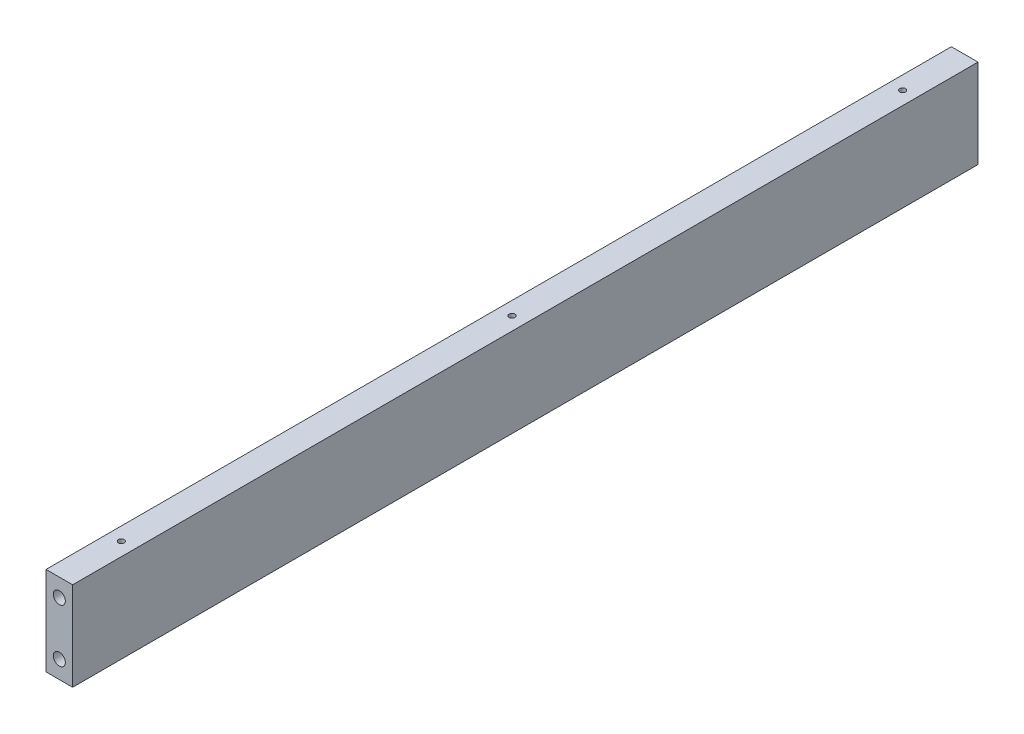
ISO-10303-21;
HEADER;
FILE_DESCRIPTION(('STEP AP214'),'2;1');
FILE_NAME('part.step','',(''),(''),'','','');
FILE_SCHEMA(('AUTOMOTIVE_DESIGN { 1 0 10303 214 1 1 1 1 }'));
ENDSEC;
DATA;
#1=APPLICATION_CONTEXT('core data for automotive mechanical design processes');
#2=APPLICATION_PROTOCOL_DEFINITION('international standard','automotive_design',2000,#1);
#3=PRODUCT_CONTEXT('',#1,'mechanical');
#4=PRODUCT('Part','Part','',(#3));
#5=PRODUCT_RELATED_PRODUCT_CATEGORY('part','',(#4));
#6=PRODUCT_DEFINITION_FORMATION('','',#4);
#7=PRODUCT_DEFINITION_CONTEXT('part definition',#1,'design');
#8=PRODUCT_DEFINITION('design','',#6,#7);
#9=PRODUCT_DEFINITION_SHAPE('','',#8);
#10=(LENGTH_UNIT() NAMED_UNIT(*) SI_UNIT(.MILLI.,.METRE.));
#11=(NAMED_UNIT(*) PLANE_ANGLE_UNIT() SI_UNIT($,.RADIAN.));
#12=(NAMED_UNIT(*) SI_UNIT($,.STERADIAN.) SOLID_ANGLE_UNIT());
#13=UNCERTAINTY_MEASURE_WITH_UNIT(LENGTH_MEASURE(1.E-05),#10,'distance_accuracy_value','');
#14=(GEOMETRIC_REPRESENTATION_CONTEXT(3) GLOBAL_UNCERTAINTY_ASSIGNED_CONTEXT((#13)) GLOBAL_UNIT_ASSIGNED_CONTEXT((#10,
#11,#12)) REPRESENTATION_CONTEXT('',''));
#15=CARTESIAN_POINT('',(0.,0.,0.));
#16=DIRECTION('',(0.,0.,1.));
#17=DIRECTION('',(1.,0.,0.));
#18=AXIS2_PLACEMENT_3D('',#15,#16,#17);
#19=CARTESIAN_POINT('',(-7.5,-25.,255.));
#20=DIRECTION('',(1.,0.,0.));
#21=DIRECTION('',(0.,0.,-1.));
#22=AXIS2_PLACEMENT_3D('',#19,#20,#21);
#23=PLANE('',#22);
#24=DIRECTION('',(0.,-1.,0.));
#25=VECTOR('',#24,1.);
#26=CARTESIAN_POINT('',(-7.5,-25.,-255.));
#27=LINE('',#26,#25);
#28=CARTESIAN_POINT('',(-7.5,25.,-255.));
#29=VERTEX_POINT('',#28);
#30=CARTESIAN_POINT('',(-7.5,-25.,-255.));
#31=VERTEX_POINT('',#30);
#32=EDGE_CURVE('E156',#29,#31,#27,.T.);
#33=ORIENTED_EDGE('',*,*,#32,.T.);
#34=DIRECTION('',(0.,0.,-1.));
#35=VECTOR('',#34,1.);
#36=CARTESIAN_POINT('',(-7.5,-25.,255.));
#37=LINE('',#36,#35);
#38=CARTESIAN_POINT('',(-7.5,-25.,255.));
#39=VERTEX_POINT('',#38);
#40=EDGE_CURVE('E11',#39,#31,#37,.T.);
#41=ORIENTED_EDGE('',*,*,#40,.F.);
#42=DIRECTION('',(0.,-1.,0.));
#43=VECTOR('',#42,1.);
#44=CARTESIAN_POINT('',(-7.5,-25.,255.));
#45=LINE('',#44,#43);
#46=CARTESIAN_POINT('',(-7.5,25.,255.));
#47=VERTEX_POINT('',#46);
#48=EDGE_CURVE('E157',#47,#39,#45,.T.);
#49=ORIENTED_EDGE('',*,*,#48,.F.);
#50=DIRECTION('',(0.,0.,-1.));
#51=VECTOR('',#50,1.);
#52=CARTESIAN_POINT('',(-7.5,25.,255.));
#53=LINE('',#52,#51);
#54=EDGE_CURVE('E163',#47,#29,#53,.T.);
#55=ORIENTED_EDGE('',*,*,#54,.T.);
#56=EDGE_LOOP('',(#33,#41,#49,#55));
#57=FACE_BOUND('',#56,.T.);
#58=ADVANCED_FACE('F36',(#57),#23,.F.);
#59=CARTESIAN_POINT('',(-7.5,-25.,255.));
#60=DIRECTION('',(0.,1.,0.));
#61=DIRECTION('',(0.,0.,1.));
#62=AXIS2_PLACEMENT_3D('',#59,#60,#61);
#63=PLANE('',#62);
#64=DIRECTION('',(1.,0.,0.));
#65=VECTOR('',#64,1.);
#66=CARTESIAN_POINT('',(-7.5,-25.,-255.));
#67=LINE('',#66,#65);
#68=CARTESIAN_POINT('',(7.5,-25.,-255.));
#69=VERTEX_POINT('',#68);
#70=EDGE_CURVE('E166',#31,#69,#67,.T.);
#71=ORIENTED_EDGE('',*,*,#70,.T.);
#72=DIRECTION('',(0.,0.,-1.));
#73=VECTOR('',#72,1.);
#74=CARTESIAN_POINT('',(7.5,-25.,255.));
#75=LINE('',#74,#73);
#76=CARTESIAN_POINT('',(7.5,-25.,255.));
#77=VERTEX_POINT('',#76);
#78=EDGE_CURVE('E44',#77,#69,#75,.T.);
#79=ORIENTED_EDGE('',*,*,#78,.F.);
#80=DIRECTION('',(1.,0.,0.));
#81=VECTOR('',#80,1.);
#82=CARTESIAN_POINT('',(-7.5,-25.,255.));
#83=LINE('',#82,#81);
#84=EDGE_CURVE('E83',#39,#77,#83,.T.);
#85=ORIENTED_EDGE('',*,*,#84,.F.);
#86=ORIENTED_EDGE('',*,*,#40,.T.);
#87=EDGE_LOOP('',(#71,#79,#85,#86));
#88=FACE_BOUND('',#87,.T.);
#89=ADVANCED_FACE('F191',(#88),#63,.F.);
#90=CARTESIAN_POINT('',(7.5,-25.,255.));
#91=DIRECTION('',(-1.,0.,0.));
#92=DIRECTION('',(0.,0.,1.));
#93=AXIS2_PLACEMENT_3D('',#90,#91,#92);
#94=PLANE('',#93);
#95=DIRECTION('',(0.,1.,0.));
#96=VECTOR('',#95,1.);
#97=CARTESIAN_POINT('',(7.5,-25.,-255.));
#98=LINE('',#97,#96);
#99=CARTESIAN_POINT('',(7.5,25.,-255.));
#100=VERTEX_POINT('',#99);
#101=EDGE_CURVE('E70',#69,#100,#98,.T.);
#102=ORIENTED_EDGE('',*,*,#101,.T.);
#103=DIRECTION('',(0.,0.,-1.));
#104=VECTOR('',#103,1.);
#105=CARTESIAN_POINT('',(7.5,25.,255.));
#106=LINE('',#105,#104);
#107=CARTESIAN_POINT('',(7.5,25.,255.));
#108=VERTEX_POINT('',#107);
#109=EDGE_CURVE('E171',#108,#100,#106,.T.);
#110=ORIENTED_EDGE('',*,*,#109,.F.);
#111=DIRECTION('',(0.,1.,0.));
#112=VECTOR('',#111,1.);
#113=CARTESIAN_POINT('',(7.5,-25.,255.));
#114=LINE('',#113,#112);
#115=EDGE_CURVE('E160',#77,#108,#114,.T.);
#116=ORIENTED_EDGE('',*,*,#115,.F.);
#117=ORIENTED_EDGE('',*,*,#78,.T.);
#118=EDGE_LOOP('',(#102,#110,#116,#117));
#119=FACE_BOUND('',#118,.T.);
#120=ADVANCED_FACE('F173',(#119),#94,.F.);
#121=CARTESIAN_POINT('',(-7.5,25.,255.));
#122=DIRECTION('',(0.,-1.,0.));
#123=DIRECTION('',(0.,0.,-1.));
#124=AXIS2_PLACEMENT_3D('',#121,#122,#123);
#125=PLANE('',#124);
#126=CARTESIAN_POINT('',(0.,25.,0.));
#127=DIRECTION('',(0.,1.,0.));
#128=DIRECTION('',(0.,0.,1.));
#129=AXIS2_PLACEMENT_3D('',#126,#127,#128);
#130=CIRCLE('',#129,1.65);
#131=CARTESIAN_POINT('',(0.,25.,1.65));
#132=VERTEX_POINT('',#131);
#133=EDGE_CURVE('E116',#132,#132,#130,.T.);
#134=ORIENTED_EDGE('',*,*,#133,.F.);
#135=EDGE_LOOP('',(#134));
#136=FACE_BOUND('',#135,.T.);
#137=CARTESIAN_POINT('',(0.,25.,-220.));
#138=DIRECTION('',(0.,1.,0.));
#139=DIRECTION('',(0.,0.,1.));
#140=AXIS2_PLACEMENT_3D('',#137,#138,#139);
#141=CIRCLE('',#140,1.65);
#142=CARTESIAN_POINT('',(0.,25.,-218.35));
#143=VERTEX_POINT('',#142);
#144=EDGE_CURVE('E115',#143,#143,#141,.T.);
#145=ORIENTED_EDGE('',*,*,#144,.F.);
#146=EDGE_LOOP('',(#145));
#147=FACE_BOUND('',#146,.T.);
#148=CARTESIAN_POINT('',(0.,25.,220.));
#149=DIRECTION('',(0.,1.,0.));
#150=DIRECTION('',(0.,0.,1.));
#151=AXIS2_PLACEMENT_3D('',#148,#149,#150);
#152=CIRCLE('',#151,1.65);
#153=CARTESIAN_POINT('',(0.,25.,221.65));
#154=VERTEX_POINT('',#153);
#155=EDGE_CURVE('E126',#154,#154,#152,.T.);
#156=ORIENTED_EDGE('',*,*,#155,.F.);
#157=EDGE_LOOP('',(#156));
#158=FACE_BOUND('',#157,.T.);
#159=DIRECTION('',(-1.,0.,0.));
#160=VECTOR('',#159,1.);
#161=CARTESIAN_POINT('',(-7.5,25.,-255.));
#162=LINE('',#161,#160);
#163=EDGE_CURVE('E76',#100,#29,#162,.T.);
#164=ORIENTED_EDGE('',*,*,#163,.T.);
#165=ORIENTED_EDGE('',*,*,#54,.F.);
#166=DIRECTION('',(-1.,0.,0.));
#167=VECTOR('',#166,1.);
#168=CARTESIAN_POINT('',(-7.5,25.,255.));
#169=LINE('',#168,#167);
#170=EDGE_CURVE('E52',#108,#47,#169,.T.);
#171=ORIENTED_EDGE('',*,*,#170,.F.);
#172=ORIENTED_EDGE('',*,*,#109,.T.);
#173=EDGE_LOOP('',(#164,#165,#171,#172));
#174=FACE_BOUND('',#173,.T.);
#175=ADVANCED_FACE('F180',(#136,#147,#158,#174),#125,.F.);
#176=CARTESIAN_POINT('',(-7.5,25.,255.));
#177=DIRECTION('',(0.,0.,-1.));
#178=DIRECTION('',(-1.,0.,0.));
#179=AXIS2_PLACEMENT_3D('',#176,#177,#178);
#180=PLANE('',#179);
#181=CARTESIAN_POINT('',(0.,15.,255.));
#182=DIRECTION('',(0.,0.,1.));
#183=DIRECTION('',(1.,0.,0.));
#184=AXIS2_PLACEMENT_3D('',#181,#182,#183);
#185=CIRCLE('',#184,3.39999999999999);
#186=CARTESIAN_POINT('',(3.39999999999999,15.,255.));
#187=VERTEX_POINT('',#186);
#188=EDGE_CURVE('E144',#187,#187,#185,.T.);
#189=ORIENTED_EDGE('',*,*,#188,.F.);
#190=EDGE_LOOP('',(#189));
#191=FACE_BOUND('',#190,.T.);
#192=CARTESIAN_POINT('',(0.,-15.,255.));
#193=DIRECTION('',(0.,0.,1.));
#194=DIRECTION('',(1.,0.,0.));
#195=AXIS2_PLACEMENT_3D('',#192,#193,#194);
#196=CIRCLE('',#195,3.39999999999999);
#197=CARTESIAN_POINT('',(3.39999999999999,-15.,255.));
#198=VERTEX_POINT('',#197);
#199=EDGE_CURVE('E150',#198,#198,#196,.T.);
#200=ORIENTED_EDGE('',*,*,#199,.F.);
#201=EDGE_LOOP('',(#200));
#202=FACE_BOUND('',#201,.T.);
#203=ORIENTED_EDGE('',*,*,#48,.T.);
#204=ORIENTED_EDGE('',*,*,#84,.T.);
#205=ORIENTED_EDGE('',*,*,#115,.T.);
#206=ORIENTED_EDGE('',*,*,#170,.T.);
#207=EDGE_LOOP('',(#203,#204,#205,#206));
#208=FACE_BOUND('',#207,.T.);
#209=ADVANCED_FACE('F182',(#191,#202,#208),#180,.F.);
#210=CARTESIAN_POINT('',(-7.5,25.,-255.));
#211=DIRECTION('',(0.,0.,-1.));
#212=DIRECTION('',(-1.,0.,0.));
#213=AXIS2_PLACEMENT_3D('',#210,#211,#212);
#214=PLANE('',#213);
#215=CARTESIAN_POINT('',(0.,15.,-255.));
#216=DIRECTION('',(0.,0.,-1.));
#217=DIRECTION('',(-1.,0.,0.));
#218=AXIS2_PLACEMENT_3D('',#215,#216,#217);
#219=CIRCLE('',#218,3.39999999999999);
#220=CARTESIAN_POINT('',(-3.39999999999999,15.,-255.));
#221=VERTEX_POINT('',#220);
#222=EDGE_CURVE('E132',#221,#221,#219,.T.);
#223=ORIENTED_EDGE('',*,*,#222,.F.);
#224=EDGE_LOOP('',(#223));
#225=FACE_BOUND('',#224,.T.);
#226=CARTESIAN_POINT('',(0.,-15.,-255.));
#227=DIRECTION('',(0.,0.,-1.));
#228=DIRECTION('',(-1.,0.,0.));
#229=AXIS2_PLACEMENT_3D('',#226,#227,#228);
#230=CIRCLE('',#229,3.39999999999999);
#231=CARTESIAN_POINT('',(-3.39999999999999,-15.,-255.));
#232=VERTEX_POINT('',#231);
#233=EDGE_CURVE('E138',#232,#232,#230,.T.);
#234=ORIENTED_EDGE('',*,*,#233,.F.);
#235=EDGE_LOOP('',(#234));
#236=FACE_BOUND('',#235,.T.);
#237=ORIENTED_EDGE('',*,*,#32,.F.);
#238=ORIENTED_EDGE('',*,*,#163,.F.);
#239=ORIENTED_EDGE('',*,*,#101,.F.);
#240=ORIENTED_EDGE('',*,*,#70,.F.);
#241=EDGE_LOOP('',(#237,#238,#239,#240));
#242=FACE_BOUND('',#241,.T.);
#243=ADVANCED_FACE('F176',(#225,#236,#242),#214,.T.);
#244=CARTESIAN_POINT('',(0.,-15.,228.75));
#245=DIRECTION('',(0.,0.,1.));
#246=DIRECTION('',(1.,0.,0.));
#247=AXIS2_PLACEMENT_3D('',#244,#245,#246);
#248=CONICAL_SURFACE('',#247,3.39999999999999,1.02974425867665);
#249=CARTESIAN_POINT('',(0.,-15.,226.707073895306));
#250=VERTEX_POINT('',#249);
#251=VERTEX_LOOP('',#250);
#252=FACE_BOUND('',#251,.T.);
#253=CARTESIAN_POINT('',(0.,-15.,228.75));
#254=DIRECTION('',(0.,0.,1.));
#255=DIRECTION('',(1.,0.,0.));
#256=AXIS2_PLACEMENT_3D('',#253,#254,#255);
#257=CIRCLE('',#256,3.39999999999999);
#258=CARTESIAN_POINT('',(3.39999999999999,-15.,228.75));
#259=VERTEX_POINT('',#258);
#260=EDGE_CURVE('E153',#259,#259,#257,.T.);
#261=ORIENTED_EDGE('',*,*,#260,.T.);
#262=EDGE_LOOP('',(#261));
#263=FACE_BOUND('',#262,.T.);
#264=ADVANCED_FACE('F220',(#252,#263),#248,.F.);
#265=CARTESIAN_POINT('',(0.,-15.,255.));
#266=DIRECTION('',(0.,0.,1.));
#267=DIRECTION('',(1.,0.,0.));
#268=AXIS2_PLACEMENT_3D('',#265,#266,#267);
#269=CYLINDRICAL_SURFACE('',#268,3.39999999999999);
#270=ORIENTED_EDGE('',*,*,#260,.F.);
#271=EDGE_LOOP('',(#270));
#272=FACE_BOUND('',#271,.T.);
#273=ORIENTED_EDGE('',*,*,#199,.T.);
#274=EDGE_LOOP('',(#273));
#275=FACE_BOUND('',#274,.T.);
#276=ADVANCED_FACE('F225',(#272,#275),#269,.F.);
#277=CARTESIAN_POINT('',(0.,15.,228.75));
#278=DIRECTION('',(0.,0.,1.));
#279=DIRECTION('',(1.,0.,0.));
#280=AXIS2_PLACEMENT_3D('',#277,#278,#279);
#281=CONICAL_SURFACE('',#280,3.39999999999999,1.02974425867665);
#282=CARTESIAN_POINT('',(0.,15.,226.707073895306));
#283=VERTEX_POINT('',#282);
#284=VERTEX_LOOP('',#283);
#285=FACE_BOUND('',#284,.T.);
#286=CARTESIAN_POINT('',(0.,15.,228.75));
#287=DIRECTION('',(0.,0.,1.));
#288=DIRECTION('',(1.,0.,0.));
#289=AXIS2_PLACEMENT_3D('',#286,#287,#288);
#290=CIRCLE('',#289,3.39999999999999);
#291=CARTESIAN_POINT('',(3.39999999999999,15.,228.75));
#292=VERTEX_POINT('',#291);
#293=EDGE_CURVE('E147',#292,#292,#290,.T.);
#294=ORIENTED_EDGE('',*,*,#293,.T.);
#295=EDGE_LOOP('',(#294));
#296=FACE_BOUND('',#295,.T.);
#297=ADVANCED_FACE('F236',(#285,#296),#281,.F.);
#298=CARTESIAN_POINT('',(0.,15.,255.));
#299=DIRECTION('',(0.,0.,1.));
#300=DIRECTION('',(1.,0.,0.));
#301=AXIS2_PLACEMENT_3D('',#298,#299,#300);
#302=CYLINDRICAL_SURFACE('',#301,3.39999999999999);
#303=ORIENTED_EDGE('',*,*,#293,.F.);
#304=EDGE_LOOP('',(#303));
#305=FACE_BOUND('',#304,.T.);
#306=ORIENTED_EDGE('',*,*,#188,.T.);
#307=EDGE_LOOP('',(#306));
#308=FACE_BOUND('',#307,.T.);
#309=ADVANCED_FACE('F248',(#305,#308),#302,.F.);
#310=CARTESIAN_POINT('',(0.,-15.,-228.75));
#311=DIRECTION('',(0.,0.,-1.));
#312=DIRECTION('',(-1.,0.,0.));
#313=AXIS2_PLACEMENT_3D('',#310,#311,#312);
#314=CONICAL_SURFACE('',#313,3.39999999999999,1.02974425867665);
#315=CARTESIAN_POINT('',(0.,-15.,-226.707073895306));
#316=VERTEX_POINT('',#315);
#317=VERTEX_LOOP('',#316);
#318=FACE_BOUND('',#317,.T.);
#319=CARTESIAN_POINT('',(0.,-15.,-228.75));
#320=DIRECTION('',(0.,0.,-1.));
#321=DIRECTION('',(-1.,0.,0.));
#322=AXIS2_PLACEMENT_3D('',#319,#320,#321);
#323=CIRCLE('',#322,3.39999999999999);
#324=CARTESIAN_POINT('',(-3.4,-15.,-228.75));
#325=VERTEX_POINT('',#324);
#326=EDGE_CURVE('E141',#325,#325,#323,.T.);
#327=ORIENTED_EDGE('',*,*,#326,.T.);
#328=EDGE_LOOP('',(#327));
#329=FACE_BOUND('',#328,.T.);
#330=ADVANCED_FACE('F258',(#318,#329),#314,.F.);
#331=CARTESIAN_POINT('',(0.,-15.,-255.));
#332=DIRECTION('',(0.,0.,-1.));
#333=DIRECTION('',(-1.,0.,0.));
#334=AXIS2_PLACEMENT_3D('',#331,#332,#333);
#335=CYLINDRICAL_SURFACE('',#334,3.39999999999999);
#336=ORIENTED_EDGE('',*,*,#326,.F.);
#337=EDGE_LOOP('',(#336));
#338=FACE_BOUND('',#337,.T.);
#339=ORIENTED_EDGE('',*,*,#233,.T.);
#340=EDGE_LOOP('',(#339));
#341=FACE_BOUND('',#340,.T.);
#342=ADVANCED_FACE('F276',(#338,#341),#335,.F.);
#343=CARTESIAN_POINT('',(0.,15.,-228.75));
#344=DIRECTION('',(0.,0.,-1.));
#345=DIRECTION('',(-1.,0.,0.));
#346=AXIS2_PLACEMENT_3D('',#343,#344,#345);
#347=CONICAL_SURFACE('',#346,3.39999999999999,1.02974425867665);
#348=CARTESIAN_POINT('',(0.,15.,-226.707073895306));
#349=VERTEX_POINT('',#348);
#350=VERTEX_LOOP('',#349);
#351=FACE_BOUND('',#350,.T.);
#352=CARTESIAN_POINT('',(0.,15.,-228.75));
#353=DIRECTION('',(0.,0.,-1.));
#354=DIRECTION('',(-1.,0.,0.));
#355=AXIS2_PLACEMENT_3D('',#352,#353,#354);
#356=CIRCLE('',#355,3.39999999999999);
#357=CARTESIAN_POINT('',(-3.4,15.,-228.75));
#358=VERTEX_POINT('',#357);
#359=EDGE_CURVE('E135',#358,#358,#356,.T.);
#360=ORIENTED_EDGE('',*,*,#359,.T.);
#361=EDGE_LOOP('',(#360));
#362=FACE_BOUND('',#361,.T.);
#363=ADVANCED_FACE('F286',(#351,#362),#347,.F.);
#364=CARTESIAN_POINT('',(0.,15.,-255.));
#365=DIRECTION('',(0.,0.,-1.));
#366=DIRECTION('',(-1.,0.,0.));
#367=AXIS2_PLACEMENT_3D('',#364,#365,#366);
#368=CYLINDRICAL_SURFACE('',#367,3.39999999999999);
#369=ORIENTED_EDGE('',*,*,#359,.F.);
#370=EDGE_LOOP('',(#369));
#371=FACE_BOUND('',#370,.T.);
#372=ORIENTED_EDGE('',*,*,#222,.T.);
#373=EDGE_LOOP('',(#372));
#374=FACE_BOUND('',#373,.T.);
#375=ADVANCED_FACE('F298',(#371,#374),#368,.F.);
#376=CARTESIAN_POINT('',(0.,9.5,220.));
#377=DIRECTION('',(0.,1.,0.));
#378=DIRECTION('',(0.,0.,1.));
#379=AXIS2_PLACEMENT_3D('',#376,#377,#378);
#380=CONICAL_SURFACE('',#379,1.65,1.02974425867665);
#381=CARTESIAN_POINT('',(0.,8.50857997860453,220.));
#382=VERTEX_POINT('',#381);
#383=VERTEX_LOOP('',#382);
#384=FACE_BOUND('',#383,.T.);
#385=CARTESIAN_POINT('',(0.,9.5,220.));
#386=DIRECTION('',(0.,1.,0.));
#387=DIRECTION('',(0.,0.,1.));
#388=AXIS2_PLACEMENT_3D('',#385,#386,#387);
#389=CIRCLE('',#388,1.65);
#390=CARTESIAN_POINT('',(0.,9.5,221.65));
#391=VERTEX_POINT('',#390);
#392=EDGE_CURVE('E129',#391,#391,#389,.T.);
#393=ORIENTED_EDGE('',*,*,#392,.T.);
#394=EDGE_LOOP('',(#393));
#395=FACE_BOUND('',#394,.T.);
#396=ADVANCED_FACE('F307',(#384,#395),#380,.F.);
#397=CARTESIAN_POINT('',(0.,25.,220.));
#398=DIRECTION('',(0.,1.,0.));
#399=DIRECTION('',(0.,0.,1.));
#400=AXIS2_PLACEMENT_3D('',#397,#398,#399);
#401=CYLINDRICAL_SURFACE('',#400,1.65);
#402=ORIENTED_EDGE('',*,*,#392,.F.);
#403=EDGE_LOOP('',(#402));
#404=FACE_BOUND('',#403,.T.);
#405=ORIENTED_EDGE('',*,*,#155,.T.);
#406=EDGE_LOOP('',(#405));
#407=FACE_BOUND('',#406,.T.);
#408=ADVANCED_FACE('F323',(#404,#407),#401,.F.);
#409=CARTESIAN_POINT('',(0.,9.5,-220.));
#410=DIRECTION('',(0.,1.,0.));
#411=DIRECTION('',(0.,0.,1.));
#412=AXIS2_PLACEMENT_3D('',#409,#410,#411);
#413=CONICAL_SURFACE('',#412,1.65,1.02974425867665);
#414=CARTESIAN_POINT('',(0.,8.50857997860453,-220.));
#415=VERTEX_POINT('',#414);
#416=VERTEX_LOOP('',#415);
#417=FACE_BOUND('',#416,.T.);
#418=CARTESIAN_POINT('',(0.,9.5,-220.));
#419=DIRECTION('',(0.,1.,0.));
#420=DIRECTION('',(0.,0.,1.));
#421=AXIS2_PLACEMENT_3D('',#418,#419,#420);
#422=CIRCLE('',#421,1.65);
#423=CARTESIAN_POINT('',(0.,9.5,-218.35));
#424=VERTEX_POINT('',#423);
#425=EDGE_CURVE('E119',#424,#424,#422,.T.);
#426=ORIENTED_EDGE('',*,*,#425,.T.);
#427=EDGE_LOOP('',(#426));
#428=FACE_BOUND('',#427,.T.);
#429=ADVANCED_FACE('F333',(#417,#428),#413,.F.);
#430=CARTESIAN_POINT('',(0.,25.,-220.));
#431=DIRECTION('',(0.,1.,0.));
#432=DIRECTION('',(0.,0.,1.));
#433=AXIS2_PLACEMENT_3D('',#430,#431,#432);
#434=CYLINDRICAL_SURFACE('',#433,1.65);
#435=ORIENTED_EDGE('',*,*,#425,.F.);
#436=EDGE_LOOP('',(#435));
#437=FACE_BOUND('',#436,.T.);
#438=ORIENTED_EDGE('',*,*,#144,.T.);
#439=EDGE_LOOP('',(#438));
#440=FACE_BOUND('',#439,.T.);
#441=ADVANCED_FACE('F109',(#437,#440),#434,.F.);
#442=CARTESIAN_POINT('',(0.,9.5,0.));
#443=DIRECTION('',(0.,1.,0.));
#444=DIRECTION('',(0.,0.,1.));
#445=AXIS2_PLACEMENT_3D('',#442,#443,#444);
#446=CONICAL_SURFACE('',#445,1.65,1.02974425867665);
#447=CARTESIAN_POINT('',(0.,8.50857997860453,0.));
#448=VERTEX_POINT('',#447);
#449=VERTEX_LOOP('',#448);
#450=FACE_BOUND('',#449,.T.);
#451=CARTESIAN_POINT('',(0.,9.5,0.));
#452=DIRECTION('',(0.,1.,0.));
#453=DIRECTION('',(0.,0.,1.));
#454=AXIS2_PLACEMENT_3D('',#451,#452,#453);
#455=CIRCLE('',#454,1.65);
#456=CARTESIAN_POINT('',(0.,9.5,1.65));
#457=VERTEX_POINT('',#456);
#458=EDGE_CURVE('E113',#457,#457,#455,.T.);
#459=ORIENTED_EDGE('',*,*,#458,.T.);
#460=EDGE_LOOP('',(#459));
#461=FACE_BOUND('',#460,.T.);
#462=ADVANCED_FACE('F105',(#450,#461),#446,.F.);
#463=CARTESIAN_POINT('',(0.,25.,0.));
#464=DIRECTION('',(0.,1.,0.));
#465=DIRECTION('',(0.,0.,1.));
#466=AXIS2_PLACEMENT_3D('',#463,#464,#465);
#467=CYLINDRICAL_SURFACE('',#466,1.65);
#468=ORIENTED_EDGE('',*,*,#458,.F.);
#469=EDGE_LOOP('',(#468));
#470=FACE_BOUND('',#469,.T.);
#471=ORIENTED_EDGE('',*,*,#133,.T.);
#472=EDGE_LOOP('',(#471));
#473=FACE_BOUND('',#472,.T.);
#474=ADVANCED_FACE('F108',(#470,#473),#467,.F.);
#475=CLOSED_SHELL('',(#58,#89,#120,#175,#209,#243,#264,#276,#297,#309,#330,#342,#363,#375,#396,
#408,#429,#441,#462,#474));
#476=MANIFOLD_SOLID_BREP('B2',#475);
#477=ADVANCED_BREP_SHAPE_REPRESENTATION('',(#18,#476),#14);
#478=SHAPE_DEFINITION_REPRESENTATION(#9,#477);
ENDSEC;
END-ISO-10303-21;
